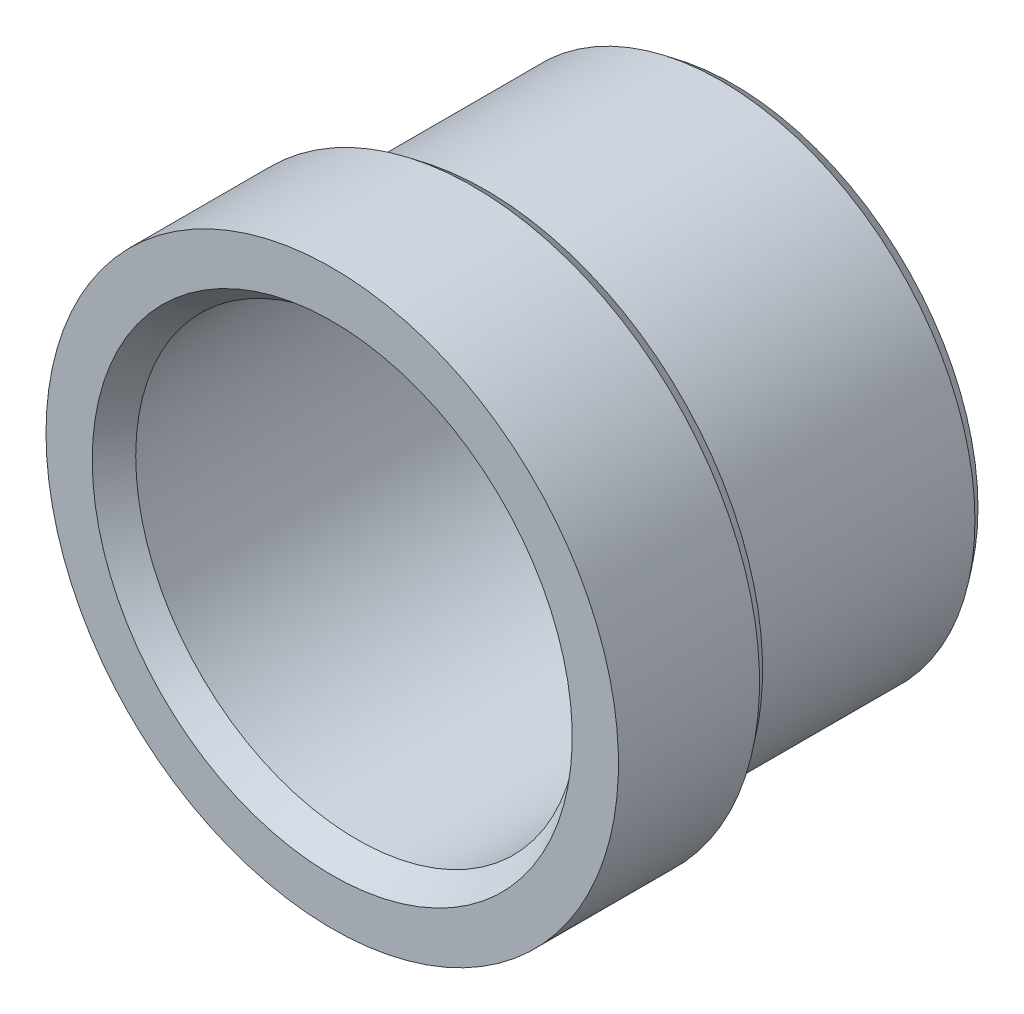
ISO-10303-21;
HEADER;
FILE_DESCRIPTION(('STEP AP214'),'2;1');
FILE_NAME('part.step','',(''),(''),'','','');
FILE_SCHEMA(('AUTOMOTIVE_DESIGN { 1 0 10303 214 1 1 1 1 }'));
ENDSEC;
DATA;
#1=APPLICATION_CONTEXT('core data for automotive mechanical design processes');
#2=APPLICATION_PROTOCOL_DEFINITION('international standard','automotive_design',2000,#1);
#3=PRODUCT_CONTEXT('',#1,'mechanical');
#4=PRODUCT('Part','Part','',(#3));
#5=PRODUCT_RELATED_PRODUCT_CATEGORY('part','',(#4));
#6=PRODUCT_DEFINITION_FORMATION('','',#4);
#7=PRODUCT_DEFINITION_CONTEXT('part definition',#1,'design');
#8=PRODUCT_DEFINITION('design','',#6,#7);
#9=PRODUCT_DEFINITION_SHAPE('','',#8);
#10=(LENGTH_UNIT() NAMED_UNIT(*) SI_UNIT(.MILLI.,.METRE.));
#11=(NAMED_UNIT(*) PLANE_ANGLE_UNIT() SI_UNIT($,.RADIAN.));
#12=(NAMED_UNIT(*) SI_UNIT($,.STERADIAN.) SOLID_ANGLE_UNIT());
#13=UNCERTAINTY_MEASURE_WITH_UNIT(LENGTH_MEASURE(1.E-05),#10,'distance_accuracy_value','');
#14=(GEOMETRIC_REPRESENTATION_CONTEXT(3) GLOBAL_UNCERTAINTY_ASSIGNED_CONTEXT((#13)) GLOBAL_UNIT_ASSIGNED_CONTEXT((#10,
#11,#12)) REPRESENTATION_CONTEXT('',''));
#15=CARTESIAN_POINT('',(0.,0.,0.));
#16=DIRECTION('',(0.,0.,1.));
#17=DIRECTION('',(1.,0.,0.));
#18=AXIS2_PLACEMENT_3D('',#15,#16,#17);
#19=CARTESIAN_POINT('',(0.,0.,-8.636));
#20=DIRECTION('',(0.,0.,-1.));
#21=DIRECTION('',(-1.,0.,0.));
#22=AXIS2_PLACEMENT_3D('',#19,#20,#21);
#23=CYLINDRICAL_SURFACE('',#22,9.525);
#24=CARTESIAN_POINT('',(0.,0.,-8.636));
#25=DIRECTION('',(0.,0.,-1.));
#26=DIRECTION('',(-1.,0.,0.));
#27=AXIS2_PLACEMENT_3D('',#24,#25,#26);
#28=CIRCLE('',#27,9.525);
#29=CARTESIAN_POINT('',(-9.525,0.,-8.636));
#30=VERTEX_POINT('',#29);
#31=EDGE_CURVE('E55',#30,#30,#28,.T.);
#32=ORIENTED_EDGE('',*,*,#31,.T.);
#33=EDGE_LOOP('',(#32));
#34=FACE_BOUND('',#33,.T.);
#35=CARTESIAN_POINT('',(0.,0.,7.5692));
#36=DIRECTION('',(0.,0.,-1.));
#37=DIRECTION('',(-1.,0.,0.));
#38=AXIS2_PLACEMENT_3D('',#35,#36,#37);
#39=CIRCLE('',#38,9.525);
#40=CARTESIAN_POINT('',(-9.525,0.,7.5692));
#41=VERTEX_POINT('',#40);
#42=EDGE_CURVE('E67',#41,#41,#39,.T.);
#43=ORIENTED_EDGE('',*,*,#42,.F.);
#44=EDGE_LOOP('',(#43));
#45=FACE_BOUND('',#44,.T.);
#46=ADVANCED_FACE('F35',(#34,#45),#23,.F.);
#47=CARTESIAN_POINT('',(0.,9.525,-8.636));
#48=DIRECTION('',(0.,0.,-1.));
#49=DIRECTION('',(-1.,0.,0.));
#50=AXIS2_PLACEMENT_3D('',#47,#48,#49);
#51=PLANE('',#50);
#52=CARTESIAN_POINT('',(0.,0.,-8.636));
#53=DIRECTION('',(0.,0.,-1.));
#54=DIRECTION('',(-1.,0.,0.));
#55=AXIS2_PLACEMENT_3D('',#52,#53,#54);
#56=CIRCLE('',#55,10.5200542696752);
#57=CARTESIAN_POINT('',(10.5200542696752,0.,-8.636));
#58=VERTEX_POINT('',#57);
#59=EDGE_CURVE('E50',#58,#58,#56,.T.);
#60=ORIENTED_EDGE('',*,*,#59,.T.);
#61=EDGE_LOOP('',(#60));
#62=FACE_BOUND('',#61,.T.);
#63=ORIENTED_EDGE('',*,*,#31,.F.);
#64=EDGE_LOOP('',(#63));
#65=FACE_BOUND('',#64,.T.);
#66=ADVANCED_FACE('F75',(#62,#65),#51,.T.);
#67=CARTESIAN_POINT('',(0.,0.,-8.636));
#68=DIRECTION('',(0.,0.,-1.));
#69=DIRECTION('',(-1.,0.,0.));
#70=AXIS2_PLACEMENT_3D('',#67,#68,#69);
#71=CYLINDRICAL_SURFACE('',#70,10.922);
#72=CARTESIAN_POINT('',(0.,0.,-8.10260000000001));
#73=DIRECTION('',(0.,0.,-1.));
#74=DIRECTION('',(-1.,0.,0.));
#75=AXIS2_PLACEMENT_3D('',#72,#73,#74);
#76=CIRCLE('',#75,10.922);
#77=CARTESIAN_POINT('',(10.922,0.,-8.10260000000001));
#78=VERTEX_POINT('',#77);
#79=EDGE_CURVE('E46',#78,#78,#76,.F.);
#80=ORIENTED_EDGE('',*,*,#79,.T.);
#81=EDGE_LOOP('',(#80));
#82=FACE_BOUND('',#81,.T.);
#83=CARTESIAN_POINT('',(0.,0.,2.032));
#84=DIRECTION('',(0.,0.,-1.));
#85=DIRECTION('',(-1.,0.,0.));
#86=AXIS2_PLACEMENT_3D('',#83,#84,#85);
#87=CIRCLE('',#86,10.922);
#88=CARTESIAN_POINT('',(-10.922,0.,2.032));
#89=VERTEX_POINT('',#88);
#90=EDGE_CURVE('E58',#89,#89,#87,.T.);
#91=ORIENTED_EDGE('',*,*,#90,.T.);
#92=EDGE_LOOP('',(#91));
#93=FACE_BOUND('',#92,.T.);
#94=ADVANCED_FACE('F82',(#82,#93),#71,.T.);
#95=CARTESIAN_POINT('',(0.,10.922,2.032));
#96=DIRECTION('',(0.,0.,-1.));
#97=DIRECTION('',(-1.,0.,0.));
#98=AXIS2_PLACEMENT_3D('',#95,#96,#97);
#99=PLANE('',#98);
#100=CARTESIAN_POINT('',(0.,0.,2.032));
#101=DIRECTION('',(0.,0.,-1.));
#102=DIRECTION('',(-1.,0.,0.));
#103=AXIS2_PLACEMENT_3D('',#100,#101,#102);
#104=CIRCLE('',#103,11.9170542696752);
#105=CARTESIAN_POINT('',(-11.9170542696752,0.,2.032));
#106=VERTEX_POINT('',#105);
#107=EDGE_CURVE('E42',#106,#106,#104,.T.);
#108=ORIENTED_EDGE('',*,*,#107,.T.);
#109=EDGE_LOOP('',(#108));
#110=FACE_BOUND('',#109,.T.);
#111=ORIENTED_EDGE('',*,*,#90,.F.);
#112=EDGE_LOOP('',(#111));
#113=FACE_BOUND('',#112,.T.);
#114=ADVANCED_FACE('F105',(#110,#113),#99,.T.);
#115=CARTESIAN_POINT('',(0.,0.,-8.636));
#116=DIRECTION('',(0.,0.,-1.));
#117=DIRECTION('',(-1.,0.,0.));
#118=AXIS2_PLACEMENT_3D('',#115,#116,#117);
#119=CYLINDRICAL_SURFACE('',#118,12.319);
#120=CARTESIAN_POINT('',(0.,0.,2.5654));
#121=DIRECTION('',(0.,0.,-1.));
#122=DIRECTION('',(-1.,0.,0.));
#123=AXIS2_PLACEMENT_3D('',#120,#121,#122);
#124=CIRCLE('',#123,12.319);
#125=CARTESIAN_POINT('',(-12.319,0.,2.5654));
#126=VERTEX_POINT('',#125);
#127=EDGE_CURVE('E10',#126,#126,#124,.F.);
#128=ORIENTED_EDGE('',*,*,#127,.T.);
#129=EDGE_LOOP('',(#128));
#130=FACE_BOUND('',#129,.T.);
#131=CARTESIAN_POINT('',(0.,0.,8.636));
#132=DIRECTION('',(0.,0.,-1.));
#133=DIRECTION('',(-1.,0.,0.));
#134=AXIS2_PLACEMENT_3D('',#131,#132,#133);
#135=CIRCLE('',#134,12.319);
#136=CARTESIAN_POINT('',(-12.319,0.,8.636));
#137=VERTEX_POINT('',#136);
#138=EDGE_CURVE('E61',#137,#137,#135,.T.);
#139=ORIENTED_EDGE('',*,*,#138,.T.);
#140=EDGE_LOOP('',(#139));
#141=FACE_BOUND('',#140,.T.);
#142=ADVANCED_FACE('F109',(#130,#141),#119,.T.);
#143=CARTESIAN_POINT('',(0.,12.319,8.636));
#144=DIRECTION('',(0.,0.,1.));
#145=DIRECTION('',(1.,0.,0.));
#146=AXIS2_PLACEMENT_3D('',#143,#144,#145);
#147=PLANE('',#146);
#148=CARTESIAN_POINT('',(0.,0.,8.636));
#149=DIRECTION('',(0.,0.,-1.));
#150=DIRECTION('',(-1.,0.,0.));
#151=AXIS2_PLACEMENT_3D('',#148,#149,#150);
#152=CIRCLE('',#151,10.3288914606497);
#153=CARTESIAN_POINT('',(-10.3288914606497,0.,8.636));
#154=VERTEX_POINT('',#153);
#155=EDGE_CURVE('E64',#154,#154,#152,.T.);
#156=ORIENTED_EDGE('',*,*,#155,.T.);
#157=EDGE_LOOP('',(#156));
#158=FACE_BOUND('',#157,.T.);
#159=ORIENTED_EDGE('',*,*,#138,.F.);
#160=EDGE_LOOP('',(#159));
#161=FACE_BOUND('',#160,.T.);
#162=ADVANCED_FACE('F95',(#158,#161),#147,.T.);
#163=CARTESIAN_POINT('',(0.,0.,8.636));
#164=DIRECTION('',(0.,0.,1.));
#165=DIRECTION('',(1.,0.,0.));
#166=AXIS2_PLACEMENT_3D('',#163,#164,#165);
#167=CONICAL_SURFACE('',#166,10.3288914606497,0.645771823237905);
#168=ORIENTED_EDGE('',*,*,#42,.T.);
#169=EDGE_LOOP('',(#168));
#170=FACE_BOUND('',#169,.T.);
#171=ORIENTED_EDGE('',*,*,#155,.F.);
#172=EDGE_LOOP('',(#171));
#173=FACE_BOUND('',#172,.T.);
#174=ADVANCED_FACE('F71',(#170,#173),#167,.F.);
#175=CARTESIAN_POINT('',(0.,0.,-8.636));
#176=DIRECTION('',(0.,0.,1.));
#177=DIRECTION('',(1.,0.,0.));
#178=AXIS2_PLACEMENT_3D('',#175,#176,#177);
#179=CONICAL_SURFACE('',#178,10.5200542696752,0.645771823237904);
#180=CARTESIAN_POINT('',(10.922,0.,-8.10260000000001));
#181=CARTESIAN_POINT('',(10.9178130653091,0.,-8.10815625000001));
#182=CARTESIAN_POINT('',(10.9136261306182,0.,-8.11371250000001));
#183=CARTESIAN_POINT('',(10.9052522612365,0.,-8.12482500000001));
#184=CARTESIAN_POINT('',(10.9010653265456,0.,-8.13038125000001));
#185=CARTESIAN_POINT('',(10.8926914571638,0.,-8.14149375000001));
#186=CARTESIAN_POINT('',(10.8885045224729,0.,-8.14705000000001));
#187=CARTESIAN_POINT('',(10.8801306530912,0.,-8.15816250000001));
#188=CARTESIAN_POINT('',(10.8759437184003,0.,-8.16371875000001));
#189=CARTESIAN_POINT('',(10.8675698490185,0.,-8.17483125000001));
#190=CARTESIAN_POINT('',(10.8633829143276,0.,-8.18038750000001));
#191=CARTESIAN_POINT('',(10.8550090449459,0.,-8.19150000000001));
#192=CARTESIAN_POINT('',(10.850822110255,0.,-8.19705625000001));
#193=CARTESIAN_POINT('',(10.8424482408732,0.,-8.20816875000001));
#194=CARTESIAN_POINT('',(10.8382613061823,0.,-8.21372500000001));
#195=CARTESIAN_POINT('',(10.8298874368006,0.,-8.22483750000001));
#196=CARTESIAN_POINT('',(10.8257005021097,0.,-8.23039375000001));
#197=CARTESIAN_POINT('',(10.8173266327279,0.,-8.24150625000001));
#198=CARTESIAN_POINT('',(10.813139698037,0.,-8.24706250000001));
#199=CARTESIAN_POINT('',(10.8047658286553,0.,-8.25817500000001));
#200=CARTESIAN_POINT('',(10.8005788939644,0.,-8.26373125000001));
#201=CARTESIAN_POINT('',(10.7922050245826,0.,-8.27484375000001));
#202=CARTESIAN_POINT('',(10.7880180898917,0.,-8.28040000000001));
#203=CARTESIAN_POINT('',(10.77964422051,0.,-8.29151250000001));
#204=CARTESIAN_POINT('',(10.7754572858191,0.,-8.29706875000001));
#205=CARTESIAN_POINT('',(10.7670834164373,0.,-8.30818125000001));
#206=CARTESIAN_POINT('',(10.7628964817464,0.,-8.31373750000001));
#207=CARTESIAN_POINT('',(10.7545226123647,0.,-8.32485000000001));
#208=CARTESIAN_POINT('',(10.7503356776738,0.,-8.33040625000001));
#209=CARTESIAN_POINT('',(10.741961808292,0.,-8.34151875000001));
#210=CARTESIAN_POINT('',(10.7377748736011,0.,-8.34707500000001));
#211=CARTESIAN_POINT('',(10.7294010042194,0.,-8.35818750000001));
#212=CARTESIAN_POINT('',(10.7252140695285,0.,-8.36374375000001));
#213=CARTESIAN_POINT('',(10.7168402001467,0.,-8.37485625000001));
#214=CARTESIAN_POINT('',(10.7126532654558,0.,-8.38041250000001));
#215=CARTESIAN_POINT('',(10.7042793960741,0.,-8.39152500000001));
#216=CARTESIAN_POINT('',(10.7000924613832,0.,-8.39708125000001));
#217=CARTESIAN_POINT('',(10.6917185920014,0.,-8.40819375000001));
#218=CARTESIAN_POINT('',(10.6875316573105,0.,-8.41375));
#219=CARTESIAN_POINT('',(10.6791577879288,0.,-8.42486250000001));
#220=CARTESIAN_POINT('',(10.6749708532379,0.,-8.43041875));
#221=CARTESIAN_POINT('',(10.6665969838561,0.,-8.44153125000001));
#222=CARTESIAN_POINT('',(10.6624100491652,0.,-8.4470875));
#223=CARTESIAN_POINT('',(10.6540361797835,0.,-8.45820000000001));
#224=CARTESIAN_POINT('',(10.6498492450926,0.,-8.46375625));
#225=CARTESIAN_POINT('',(10.6414753757108,0.,-8.47486875));
#226=CARTESIAN_POINT('',(10.6372884410199,0.,-8.480425));
#227=CARTESIAN_POINT('',(10.6289145716382,0.,-8.4915375));
#228=CARTESIAN_POINT('',(10.6247276369473,0.,-8.49709375));
#229=CARTESIAN_POINT('',(10.6163537675655,0.,-8.50820625));
#230=CARTESIAN_POINT('',(10.6121668328746,0.,-8.5137625));
#231=CARTESIAN_POINT('',(10.6037929634929,0.,-8.524875));
#232=CARTESIAN_POINT('',(10.599606028802,0.,-8.53043125));
#233=CARTESIAN_POINT('',(10.5912321594202,0.,-8.54154375));
#234=CARTESIAN_POINT('',(10.5870452247293,0.,-8.5471));
#235=CARTESIAN_POINT('',(10.5786713553476,0.,-8.5582125));
#236=CARTESIAN_POINT('',(10.5744844206567,0.,-8.56376875));
#237=CARTESIAN_POINT('',(10.5661105512749,0.,-8.57488125));
#238=CARTESIAN_POINT('',(10.561923616584,0.,-8.5804375));
#239=CARTESIAN_POINT('',(10.5535497472023,0.,-8.59155));
#240=CARTESIAN_POINT('',(10.5493628125114,0.,-8.59710625));
#241=CARTESIAN_POINT('',(10.5409889431296,0.,-8.60821875));
#242=CARTESIAN_POINT('',(10.5368020084387,0.,-8.613775));
#243=CARTESIAN_POINT('',(10.528428139057,0.,-8.6248875));
#244=CARTESIAN_POINT('',(10.5242412043661,0.,-8.63044375));
#245=CARTESIAN_POINT('',(10.5200542696752,0.,-8.636));
#246=B_SPLINE_CURVE_WITH_KNOTS('',3,(#180,#181,#182,#183,#184,#185,#186,#187,#188,#189,#190,
#191,#192,#193,#194,#195,#196,#197,#198,#199,#200,#201,#202,#203,#204,#205,#206,#207,#208,#209,
#210,#211,#212,#213,#214,#215,#216,#217,#218,#219,#220,#221,#222,#223,#224,#225,#226,#227,#228,
#229,#230,#231,#232,#233,#234,#235,#236,#237,#238,#239,#240,#241,#242,#243,#244,#245),
.UNSPECIFIED.,.F.,.F.,(4,2,2,2,2,2,2,2,2,2,2,2,2,2,2,2,2,2,2,2,2,2,2,2,2,2,2,2,2,2,2,2,4),(0.,
0.0208715362518917,0.0417430725037821,0.0626146087556738,0.0834861450075642,0.104357681259454,
0.125229217511346,0.146100753763237,0.166972290015128,0.187843826267019,0.20871536251891,
0.229586898770802,0.250458435022692,0.271329971274584,0.292201507526474,0.313073043778366,
0.333944580030256,0.354816116282147,0.375687652534038,0.396559188785929,0.41743072503782,
0.438302261289712,0.459173797541602,0.480045333793494,0.500916870045384,0.521788406297276,
0.542659942549166,0.563531478801057,0.584403015052948,0.605274551304839,0.626146087556731,
0.647017623808622,0.667889160060514),.UNSPECIFIED.);
#247=EDGE_CURVE('BSEAM86',#78,#58,#246,.T.);
#248=ORIENTED_EDGE('',*,*,#79,.F.);
#249=ORIENTED_EDGE('',*,*,#59,.F.);
#250=ORIENTED_EDGE('',*,*,#247,.T.);
#251=ORIENTED_EDGE('',*,*,#247,.F.);
#252=EDGE_LOOP('',(#248,#250,#249,#251));
#253=FACE_BOUND('',#252,.T.);
#254=ADVANCED_FACE('F86',(#253),#179,.T.);
#255=CARTESIAN_POINT('',(0.,0.,2.032));
#256=DIRECTION('',(0.,0.,1.));
#257=DIRECTION('',(1.,0.,0.));
#258=AXIS2_PLACEMENT_3D('',#255,#256,#257);
#259=CONICAL_SURFACE('',#258,11.9170542696752,0.645771823237904);
#260=ORIENTED_EDGE('',*,*,#127,.F.);
#261=EDGE_LOOP('',(#260));
#262=FACE_BOUND('',#261,.T.);
#263=ORIENTED_EDGE('',*,*,#107,.F.);
#264=EDGE_LOOP('',(#263));
#265=FACE_BOUND('',#264,.T.);
#266=ADVANCED_FACE('F37',(#262,#265),#259,.T.);
#267=CLOSED_SHELL('',(#46,#66,#94,#114,#142,#162,#174,#254,#266));
#268=MANIFOLD_SOLID_BREP('B2',#267);
#269=ADVANCED_BREP_SHAPE_REPRESENTATION('',(#18,#268),#14);
#270=SHAPE_DEFINITION_REPRESENTATION(#9,#269);
ENDSEC;
END-ISO-10303-21;
